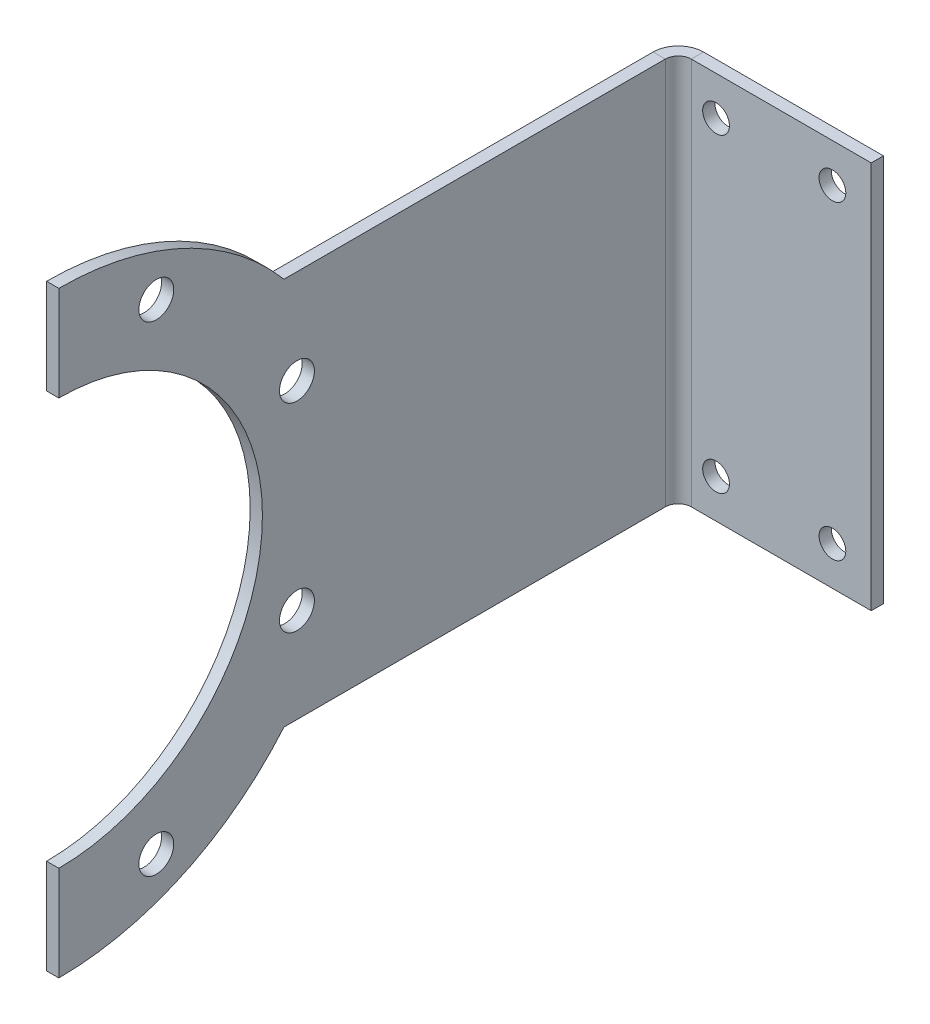
ISO-10303-21;
HEADER;
FILE_DESCRIPTION(('STEP AP214'),'2;1');
FILE_NAME('part.step','',(''),(''),'','','');
FILE_SCHEMA(('AUTOMOTIVE_DESIGN { 1 0 10303 214 1 1 1 1 }'));
ENDSEC;
DATA;
#1=APPLICATION_CONTEXT('core data for automotive mechanical design processes');
#2=APPLICATION_PROTOCOL_DEFINITION('international standard','automotive_design',2000,#1);
#3=PRODUCT_CONTEXT('',#1,'mechanical');
#4=PRODUCT('Part','Part','',(#3));
#5=PRODUCT_RELATED_PRODUCT_CATEGORY('part','',(#4));
#6=PRODUCT_DEFINITION_FORMATION('','',#4);
#7=PRODUCT_DEFINITION_CONTEXT('part definition',#1,'design');
#8=PRODUCT_DEFINITION('design','',#6,#7);
#9=PRODUCT_DEFINITION_SHAPE('','',#8);
#10=(LENGTH_UNIT() NAMED_UNIT(*) SI_UNIT(.MILLI.,.METRE.));
#11=(NAMED_UNIT(*) PLANE_ANGLE_UNIT() SI_UNIT($,.RADIAN.));
#12=(NAMED_UNIT(*) SI_UNIT($,.STERADIAN.) SOLID_ANGLE_UNIT());
#13=UNCERTAINTY_MEASURE_WITH_UNIT(LENGTH_MEASURE(1.E-05),#10,'distance_accuracy_value','');
#14=(GEOMETRIC_REPRESENTATION_CONTEXT(3) GLOBAL_UNCERTAINTY_ASSIGNED_CONTEXT((#13)) GLOBAL_UNIT_ASSIGNED_CONTEXT((#10,
#11,#12)) REPRESENTATION_CONTEXT('',''));
#15=CARTESIAN_POINT('',(0.,0.,0.));
#16=DIRECTION('',(0.,0.,1.));
#17=DIRECTION('',(1.,0.,0.));
#18=AXIS2_PLACEMENT_3D('',#15,#16,#17);
#19=CARTESIAN_POINT('',(78.810179492207,25.,50.8361885638785));
#20=DIRECTION('',(0.,1.,0.));
#21=DIRECTION('',(1.,0.,0.));
#22=AXIS2_PLACEMENT_3D('',#19,#20,#21);
#23=PLANE('',#22);
#24=DIRECTION('',(0.,0.,1.));
#25=VECTOR('',#24,1.);
#26=CARTESIAN_POINT('',(80.384979492207,25.,50.8361885638785));
#27=LINE('',#26,#25);
#28=CARTESIAN_POINT('',(80.3849794922068,25.,1.6764));
#29=VERTEX_POINT('',#28);
#30=CARTESIAN_POINT('',(80.384979492207,25.,50.8361885638785));
#31=VERTEX_POINT('',#30);
#32=EDGE_CURVE('E101',#29,#31,#27,.T.);
#33=ORIENTED_EDGE('',*,*,#32,.F.);
#34=DIRECTION('',(-1.,0.,0.));
#35=VECTOR('',#34,1.);
#36=CARTESIAN_POINT('',(78.8101794922068,25.,1.67640000000001));
#37=LINE('',#36,#35);
#38=CARTESIAN_POINT('',(78.8101794922068,25.,1.67640000000001));
#39=VERTEX_POINT('',#38);
#40=EDGE_CURVE('E176',#29,#39,#37,.T.);
#41=ORIENTED_EDGE('',*,*,#40,.T.);
#42=DIRECTION('',(0.,0.,1.));
#43=VECTOR('',#42,1.);
#44=CARTESIAN_POINT('',(78.8101794922068,25.,-0.134979492206797));
#45=LINE('',#44,#43);
#46=CARTESIAN_POINT('',(78.810179492207,25.,50.8361885638785));
#47=VERTEX_POINT('',#46);
#48=EDGE_CURVE('E51',#39,#47,#45,.T.);
#49=ORIENTED_EDGE('',*,*,#48,.T.);
#50=DIRECTION('',(1.,0.,0.));
#51=VECTOR('',#50,1.);
#52=CARTESIAN_POINT('',(78.810179492207,25.,50.8361885638785));
#53=LINE('',#52,#51);
#54=EDGE_CURVE('E167',#47,#31,#53,.T.);
#55=ORIENTED_EDGE('',*,*,#54,.T.);
#56=EDGE_LOOP('',(#33,#41,#49,#55));
#57=FACE_BOUND('',#56,.T.);
#58=ADVANCED_FACE('F47',(#57),#23,.T.);
#59=CARTESIAN_POINT('',(78.8101794922067,-25.,-25.1349794922068));
#60=DIRECTION('',(0.,-1.,0.));
#61=DIRECTION('',(-1.,0.,0.));
#62=AXIS2_PLACEMENT_3D('',#59,#60,#61);
#63=PLANE('',#62);
#64=DIRECTION('',(0.,0.,-1.));
#65=VECTOR('',#64,1.);
#66=CARTESIAN_POINT('',(78.8101794922068,-25.,-0.134979492206797));
#67=LINE('',#66,#65);
#68=CARTESIAN_POINT('',(78.810179492207,-25.,50.8361885638785));
#69=VERTEX_POINT('',#68);
#70=CARTESIAN_POINT('',(78.8101794922068,-25.,1.67640000000001));
#71=VERTEX_POINT('',#70);
#72=EDGE_CURVE('E145',#69,#71,#67,.T.);
#73=ORIENTED_EDGE('',*,*,#72,.T.);
#74=DIRECTION('',(1.,0.,0.));
#75=VECTOR('',#74,1.);
#76=CARTESIAN_POINT('',(78.8101794922068,-25.,1.67640000000001));
#77=LINE('',#76,#75);
#78=CARTESIAN_POINT('',(80.3849794922068,-25.,1.6764));
#79=VERTEX_POINT('',#78);
#80=EDGE_CURVE('E12',#71,#79,#77,.T.);
#81=ORIENTED_EDGE('',*,*,#80,.T.);
#82=DIRECTION('',(0.,0.,-1.));
#83=VECTOR('',#82,1.);
#84=CARTESIAN_POINT('',(80.3849794922067,-25.,-25.1349794922068));
#85=LINE('',#84,#83);
#86=CARTESIAN_POINT('',(80.384979492207,-25.,50.8361885638785));
#87=VERTEX_POINT('',#86);
#88=EDGE_CURVE('E166',#87,#79,#85,.T.);
#89=ORIENTED_EDGE('',*,*,#88,.F.);
#90=DIRECTION('',(1.,0.,0.));
#91=VECTOR('',#90,1.);
#92=CARTESIAN_POINT('',(78.810179492207,-25.,50.8361885638785));
#93=LINE('',#92,#91);
#94=EDGE_CURVE('E133',#69,#87,#93,.T.);
#95=ORIENTED_EDGE('',*,*,#94,.F.);
#96=EDGE_LOOP('',(#73,#81,#89,#95));
#97=FACE_BOUND('',#96,.T.);
#98=ADVANCED_FACE('F49',(#97),#63,.T.);
#99=CARTESIAN_POINT('',(78.8101794922071,0.537603285694962,79.8650205077932));
#100=DIRECTION('',(-1.,0.,0.));
#101=DIRECTION('',(0.,0.,1.));
#102=AXIS2_PLACEMENT_3D('',#99,#100,#101);
#103=PLANE('',#102);
#104=CARTESIAN_POINT('',(78.810179492207,30.9499643391282,67.2951255235629));
#105=DIRECTION('',(1.,0.,0.));
#106=DIRECTION('',(0.,0.,-1.));
#107=AXIS2_PLACEMENT_3D('',#104,#105,#106);
#108=CIRCLE('',#107,2.25);
#109=CARTESIAN_POINT('',(78.810179492207,30.9499643391282,65.0451255235629));
#110=VERTEX_POINT('',#109);
#111=EDGE_CURVE('E157',#110,#110,#108,.T.);
#112=ORIENTED_EDGE('',*,*,#111,.T.);
#113=EDGE_LOOP('',(#112));
#114=FACE_BOUND('',#113,.T.);
#115=CARTESIAN_POINT('',(78.810179492207,12.8198949842307,49.1650561686652));
#116=DIRECTION('',(1.,0.,0.));
#117=DIRECTION('',(0.,0.,-1.));
#118=AXIS2_PLACEMENT_3D('',#115,#116,#117);
#119=CIRCLE('',#118,2.25);
#120=CARTESIAN_POINT('',(78.810179492207,12.8198949842307,46.9150561686652));
#121=VERTEX_POINT('',#120);
#122=EDGE_CURVE('E191',#121,#121,#119,.T.);
#123=ORIENTED_EDGE('',*,*,#122,.T.);
#124=EDGE_LOOP('',(#123));
#125=FACE_BOUND('',#124,.T.);
#126=CARTESIAN_POINT('',(78.810179492207,-12.8198949842303,49.165056168665));
#127=DIRECTION('',(1.,0.,0.));
#128=DIRECTION('',(0.,0.,-1.));
#129=AXIS2_PLACEMENT_3D('',#126,#127,#128);
#130=CIRCLE('',#129,2.25000000000001);
#131=CARTESIAN_POINT('',(78.810179492207,-12.8198949842303,46.915056168665));
#132=VERTEX_POINT('',#131);
#133=EDGE_CURVE('E197',#132,#132,#130,.T.);
#134=ORIENTED_EDGE('',*,*,#133,.T.);
#135=EDGE_LOOP('',(#134));
#136=FACE_BOUND('',#135,.T.);
#137=CARTESIAN_POINT('',(78.810179492207,-30.949964339128,67.2951255235625));
#138=DIRECTION('',(1.,0.,0.));
#139=DIRECTION('',(0.,0.,-1.));
#140=AXIS2_PLACEMENT_3D('',#137,#138,#139);
#141=CIRCLE('',#140,2.24999999999999);
#142=CARTESIAN_POINT('',(78.810179492207,-30.949964339128,65.0451255235625));
#143=VERTEX_POINT('',#142);
#144=EDGE_CURVE('E203',#143,#143,#141,.T.);
#145=ORIENTED_EDGE('',*,*,#144,.T.);
#146=EDGE_LOOP('',(#145));
#147=FACE_BOUND('',#146,.T.);
#148=ORIENTED_EDGE('',*,*,#48,.F.);
#149=DIRECTION('',(0.,-1.,0.));
#150=VECTOR('',#149,1.);
#151=CARTESIAN_POINT('',(78.8101794922068,0.537603285694962,1.67640000000001));
#152=LINE('',#151,#150);
#153=EDGE_CURVE('E169',#39,#71,#152,.T.);
#154=ORIENTED_EDGE('',*,*,#153,.T.);
#155=ORIENTED_EDGE('',*,*,#72,.F.);
#156=CARTESIAN_POINT('',(78.8101794922071,-0.537603285694967,79.8650205077932));
#157=DIRECTION('',(1.,0.,0.));
#158=DIRECTION('',(0.,0.,-1.));
#159=AXIS2_PLACEMENT_3D('',#156,#157,#158);
#160=CIRCLE('',#159,37.9615850174368);
#161=CARTESIAN_POINT('',(78.8101794922071,-38.4991883031318,79.8650205077932));
#162=VERTEX_POINT('',#161);
#163=EDGE_CURVE('E126',#162,#69,#160,.T.);
#164=ORIENTED_EDGE('',*,*,#163,.F.);
#165=DIRECTION('',(0.,-1.,0.));
#166=VECTOR('',#165,1.);
#167=CARTESIAN_POINT('',(78.8101794922071,-38.4991883031318,79.8650205077932));
#168=LINE('',#167,#166);
#169=CARTESIAN_POINT('',(78.8101794922071,-26.2488094968134,79.8650205077932));
#170=VERTEX_POINT('',#169);
#171=EDGE_CURVE('E141',#170,#162,#168,.T.);
#172=ORIENTED_EDGE('',*,*,#171,.F.);
#173=CARTESIAN_POINT('',(78.8101794922071,0.,79.8650205077932));
#174=DIRECTION('',(-1.,0.,0.));
#175=DIRECTION('',(0.,0.,-1.));
#176=AXIS2_PLACEMENT_3D('',#173,#174,#175);
#177=CIRCLE('',#176,26.2488094968134);
#178=CARTESIAN_POINT('',(78.8101794922071,26.2488094968134,79.8650205077932));
#179=VERTEX_POINT('',#178);
#180=EDGE_CURVE('E148',#179,#170,#177,.T.);
#181=ORIENTED_EDGE('',*,*,#180,.F.);
#182=DIRECTION('',(0.,-1.,0.));
#183=VECTOR('',#182,1.);
#184=CARTESIAN_POINT('',(78.8101794922071,38.4991883031318,79.8650205077932));
#185=LINE('',#184,#183);
#186=CARTESIAN_POINT('',(78.8101794922071,38.4991883031318,79.8650205077932));
#187=VERTEX_POINT('',#186);
#188=EDGE_CURVE('E150',#187,#179,#185,.T.);
#189=ORIENTED_EDGE('',*,*,#188,.F.);
#190=CARTESIAN_POINT('',(78.8101794922071,0.537603285694962,79.8650205077932));
#191=DIRECTION('',(1.,0.,0.));
#192=DIRECTION('',(0.,0.,1.));
#193=AXIS2_PLACEMENT_3D('',#190,#191,#192);
#194=CIRCLE('',#193,37.9615850174368);
#195=EDGE_CURVE('E182',#47,#187,#194,.T.);
#196=ORIENTED_EDGE('',*,*,#195,.F.);
#197=EDGE_LOOP('',(#148,#154,#155,#164,#172,#181,#189,#196));
#198=FACE_BOUND('',#197,.T.);
#199=ADVANCED_FACE('F139',(#114,#125,#136,#147,#198),#103,.T.);
#200=CARTESIAN_POINT('',(78.8101794922071,0.537603285694962,79.8650205077932));
#201=DIRECTION('',(1.,0.,0.));
#202=DIRECTION('',(0.,0.,-1.));
#203=AXIS2_PLACEMENT_3D('',#200,#201,#202);
#204=CYLINDRICAL_SURFACE('',#203,37.9615850174368);
#205=CARTESIAN_POINT('',(80.3849794922071,0.537603285694962,79.8650205077932));
#206=DIRECTION('',(1.,0.,0.));
#207=DIRECTION('',(0.,0.,1.));
#208=AXIS2_PLACEMENT_3D('',#205,#206,#207);
#209=CIRCLE('',#208,37.9615850174368);
#210=CARTESIAN_POINT('',(80.3849794922071,38.4991883031318,79.8650205077932));
#211=VERTEX_POINT('',#210);
#212=EDGE_CURVE('E154',#31,#211,#209,.T.);
#213=ORIENTED_EDGE('',*,*,#212,.F.);
#214=ORIENTED_EDGE('',*,*,#54,.F.);
#215=ORIENTED_EDGE('',*,*,#195,.T.);
#216=DIRECTION('',(1.,0.,0.));
#217=VECTOR('',#216,1.);
#218=CARTESIAN_POINT('',(78.8101794922071,38.4991883031318,79.8650205077932));
#219=LINE('',#218,#217);
#220=EDGE_CURVE('E108',#187,#211,#219,.T.);
#221=ORIENTED_EDGE('',*,*,#220,.T.);
#222=EDGE_LOOP('',(#213,#214,#215,#221));
#223=FACE_BOUND('',#222,.T.);
#224=ADVANCED_FACE('F369',(#223),#204,.T.);
#225=CARTESIAN_POINT('',(78.8101794922071,-0.537603285694967,79.8650205077932));
#226=DIRECTION('',(1.,0.,0.));
#227=DIRECTION('',(0.,0.,-1.));
#228=AXIS2_PLACEMENT_3D('',#225,#226,#227);
#229=CYLINDRICAL_SURFACE('',#228,37.9615850174368);
#230=CARTESIAN_POINT('',(80.3849794922071,-0.537603285694967,79.8650205077932));
#231=DIRECTION('',(1.,0.,0.));
#232=DIRECTION('',(0.,0.,-1.));
#233=AXIS2_PLACEMENT_3D('',#230,#231,#232);
#234=CIRCLE('',#233,37.9615850174368);
#235=CARTESIAN_POINT('',(80.3849794922071,-38.4991883031318,79.8650205077932));
#236=VERTEX_POINT('',#235);
#237=EDGE_CURVE('E128',#236,#87,#234,.T.);
#238=ORIENTED_EDGE('',*,*,#237,.F.);
#239=DIRECTION('',(1.,0.,0.));
#240=VECTOR('',#239,1.);
#241=CARTESIAN_POINT('',(78.8101794922071,-38.4991883031318,79.8650205077932));
#242=LINE('',#241,#240);
#243=EDGE_CURVE('E122',#162,#236,#242,.T.);
#244=ORIENTED_EDGE('',*,*,#243,.F.);
#245=ORIENTED_EDGE('',*,*,#163,.T.);
#246=ORIENTED_EDGE('',*,*,#94,.T.);
#247=EDGE_LOOP('',(#238,#244,#245,#246));
#248=FACE_BOUND('',#247,.T.);
#249=ADVANCED_FACE('F124',(#248),#229,.T.);
#250=CARTESIAN_POINT('',(78.8101794922071,-38.4991883031318,79.8650205077932));
#251=DIRECTION('',(0.,0.,1.));
#252=DIRECTION('',(1.,0.,0.));
#253=AXIS2_PLACEMENT_3D('',#250,#251,#252);
#254=PLANE('',#253);
#255=DIRECTION('',(0.,-1.,0.));
#256=VECTOR('',#255,1.);
#257=CARTESIAN_POINT('',(80.3849794922071,-38.4991883031318,79.8650205077932));
#258=LINE('',#257,#256);
#259=CARTESIAN_POINT('',(80.3849794922071,-26.2488094968134,79.8650205077932));
#260=VERTEX_POINT('',#259);
#261=EDGE_CURVE('E163',#260,#236,#258,.T.);
#262=ORIENTED_EDGE('',*,*,#261,.F.);
#263=DIRECTION('',(1.,0.,0.));
#264=VECTOR('',#263,1.);
#265=CARTESIAN_POINT('',(78.8101794922071,-26.2488094968134,79.8650205077932));
#266=LINE('',#265,#264);
#267=EDGE_CURVE('E134',#170,#260,#266,.T.);
#268=ORIENTED_EDGE('',*,*,#267,.F.);
#269=ORIENTED_EDGE('',*,*,#171,.T.);
#270=ORIENTED_EDGE('',*,*,#243,.T.);
#271=EDGE_LOOP('',(#262,#268,#269,#270));
#272=FACE_BOUND('',#271,.T.);
#273=ADVANCED_FACE('F147',(#272),#254,.T.);
#274=CARTESIAN_POINT('',(78.8101794922071,0.,79.8650205077932));
#275=DIRECTION('',(1.,0.,0.));
#276=DIRECTION('',(0.,0.,-1.));
#277=AXIS2_PLACEMENT_3D('',#274,#275,#276);
#278=CYLINDRICAL_SURFACE('',#277,26.2488094968134);
#279=CARTESIAN_POINT('',(80.3849794922071,0.,79.8650205077932));
#280=DIRECTION('',(-1.,0.,0.));
#281=DIRECTION('',(0.,0.,-1.));
#282=AXIS2_PLACEMENT_3D('',#279,#280,#281);
#283=CIRCLE('',#282,26.2488094968134);
#284=CARTESIAN_POINT('',(80.3849794922071,26.2488094968134,79.8650205077932));
#285=VERTEX_POINT('',#284);
#286=EDGE_CURVE('E160',#285,#260,#283,.T.);
#287=ORIENTED_EDGE('',*,*,#286,.F.);
#288=DIRECTION('',(1.,0.,0.));
#289=VECTOR('',#288,1.);
#290=CARTESIAN_POINT('',(78.8101794922071,26.2488094968134,79.8650205077932));
#291=LINE('',#290,#289);
#292=EDGE_CURVE('E172',#179,#285,#291,.T.);
#293=ORIENTED_EDGE('',*,*,#292,.F.);
#294=ORIENTED_EDGE('',*,*,#180,.T.);
#295=ORIENTED_EDGE('',*,*,#267,.T.);
#296=EDGE_LOOP('',(#287,#293,#294,#295));
#297=FACE_BOUND('',#296,.T.);
#298=ADVANCED_FACE('F361',(#297),#278,.F.);
#299=CARTESIAN_POINT('',(78.8101794922071,38.4991883031318,79.8650205077932));
#300=DIRECTION('',(0.,0.,1.));
#301=DIRECTION('',(0.,-1.,0.));
#302=AXIS2_PLACEMENT_3D('',#299,#300,#301);
#303=PLANE('',#302);
#304=DIRECTION('',(0.,-1.,0.));
#305=VECTOR('',#304,1.);
#306=CARTESIAN_POINT('',(80.3849794922071,38.4991883031318,79.8650205077932));
#307=LINE('',#306,#305);
#308=EDGE_CURVE('E156',#211,#285,#307,.T.);
#309=ORIENTED_EDGE('',*,*,#308,.F.);
#310=ORIENTED_EDGE('',*,*,#220,.F.);
#311=ORIENTED_EDGE('',*,*,#188,.T.);
#312=ORIENTED_EDGE('',*,*,#292,.T.);
#313=EDGE_LOOP('',(#309,#310,#311,#312));
#314=FACE_BOUND('',#313,.T.);
#315=ADVANCED_FACE('F353',(#314),#303,.T.);
#316=CARTESIAN_POINT('',(80.3849794922071,0.537603285694962,79.8650205077932));
#317=DIRECTION('',(-1.,0.,0.));
#318=DIRECTION('',(0.,0.,1.));
#319=AXIS2_PLACEMENT_3D('',#316,#317,#318);
#320=PLANE('',#319);
#321=DIRECTION('',(0.,-1.,0.));
#322=VECTOR('',#321,1.);
#323=CARTESIAN_POINT('',(80.3849794922068,0.537603285694962,1.67640000000001));
#324=LINE('',#323,#322);
#325=EDGE_CURVE('E56',#29,#79,#324,.T.);
#326=ORIENTED_EDGE('',*,*,#325,.F.);
#327=ORIENTED_EDGE('',*,*,#32,.T.);
#328=ORIENTED_EDGE('',*,*,#212,.T.);
#329=ORIENTED_EDGE('',*,*,#308,.T.);
#330=ORIENTED_EDGE('',*,*,#286,.T.);
#331=ORIENTED_EDGE('',*,*,#261,.T.);
#332=ORIENTED_EDGE('',*,*,#237,.T.);
#333=ORIENTED_EDGE('',*,*,#88,.T.);
#334=EDGE_LOOP('',(#326,#327,#328,#329,#330,#331,#332,#333));
#335=FACE_BOUND('',#334,.T.);
#336=CARTESIAN_POINT('',(80.3849794922071,-30.949964339128,67.2951255235625));
#337=DIRECTION('',(1.,0.,0.));
#338=DIRECTION('',(0.,0.,-1.));
#339=AXIS2_PLACEMENT_3D('',#336,#337,#338);
#340=CIRCLE('',#339,2.24999999999999);
#341=CARTESIAN_POINT('',(80.384979492207,-30.949964339128,65.0451255235625));
#342=VERTEX_POINT('',#341);
#343=EDGE_CURVE('E206',#342,#342,#340,.T.);
#344=ORIENTED_EDGE('',*,*,#343,.F.);
#345=EDGE_LOOP('',(#344));
#346=FACE_BOUND('',#345,.T.);
#347=CARTESIAN_POINT('',(80.384979492207,-12.8198949842303,49.165056168665));
#348=DIRECTION('',(1.,0.,0.));
#349=DIRECTION('',(0.,0.,-1.));
#350=AXIS2_PLACEMENT_3D('',#347,#348,#349);
#351=CIRCLE('',#350,2.25000000000001);
#352=CARTESIAN_POINT('',(80.384979492207,-12.8198949842303,46.915056168665));
#353=VERTEX_POINT('',#352);
#354=EDGE_CURVE('E200',#353,#353,#351,.T.);
#355=ORIENTED_EDGE('',*,*,#354,.F.);
#356=EDGE_LOOP('',(#355));
#357=FACE_BOUND('',#356,.T.);
#358=CARTESIAN_POINT('',(80.384979492207,12.8198949842307,49.1650561686652));
#359=DIRECTION('',(1.,0.,0.));
#360=DIRECTION('',(0.,0.,-1.));
#361=AXIS2_PLACEMENT_3D('',#358,#359,#360);
#362=CIRCLE('',#361,2.25);
#363=CARTESIAN_POINT('',(80.384979492207,12.8198949842307,46.9150561686652));
#364=VERTEX_POINT('',#363);
#365=EDGE_CURVE('E194',#364,#364,#362,.T.);
#366=ORIENTED_EDGE('',*,*,#365,.F.);
#367=EDGE_LOOP('',(#366));
#368=FACE_BOUND('',#367,.T.);
#369=CARTESIAN_POINT('',(80.3849794922071,30.9499643391282,67.2951255235629));
#370=DIRECTION('',(1.,0.,0.));
#371=DIRECTION('',(0.,0.,-1.));
#372=AXIS2_PLACEMENT_3D('',#369,#370,#371);
#373=CIRCLE('',#372,2.25);
#374=CARTESIAN_POINT('',(80.384979492207,30.9499643391282,65.0451255235629));
#375=VERTEX_POINT('',#374);
#376=EDGE_CURVE('E188',#375,#375,#373,.T.);
#377=ORIENTED_EDGE('',*,*,#376,.F.);
#378=EDGE_LOOP('',(#377));
#379=FACE_BOUND('',#378,.T.);
#380=ADVANCED_FACE('F295',(#335,#346,#357,#368,#379),#320,.F.);
#381=CARTESIAN_POINT('',(78.810179492207,30.9499643391282,67.2951255235629));
#382=DIRECTION('',(1.,0.,0.));
#383=DIRECTION('',(0.,0.,-1.));
#384=AXIS2_PLACEMENT_3D('',#381,#382,#383);
#385=CYLINDRICAL_SURFACE('',#384,2.25);
#386=ORIENTED_EDGE('',*,*,#111,.F.);
#387=EDGE_LOOP('',(#386));
#388=FACE_BOUND('',#387,.T.);
#389=ORIENTED_EDGE('',*,*,#376,.T.);
#390=EDGE_LOOP('',(#389));
#391=FACE_BOUND('',#390,.T.);
#392=ADVANCED_FACE('F352',(#388,#391),#385,.F.);
#393=CARTESIAN_POINT('',(78.810179492207,12.8198949842307,49.1650561686652));
#394=DIRECTION('',(1.,0.,0.));
#395=DIRECTION('',(0.,0.,-1.));
#396=AXIS2_PLACEMENT_3D('',#393,#394,#395);
#397=CYLINDRICAL_SURFACE('',#396,2.25);
#398=ORIENTED_EDGE('',*,*,#122,.F.);
#399=EDGE_LOOP('',(#398));
#400=FACE_BOUND('',#399,.T.);
#401=ORIENTED_EDGE('',*,*,#365,.T.);
#402=EDGE_LOOP('',(#401));
#403=FACE_BOUND('',#402,.T.);
#404=ADVANCED_FACE('F358',(#400,#403),#397,.F.);
#405=CARTESIAN_POINT('',(78.810179492207,-12.8198949842303,49.165056168665));
#406=DIRECTION('',(1.,0.,0.));
#407=DIRECTION('',(0.,0.,-1.));
#408=AXIS2_PLACEMENT_3D('',#405,#406,#407);
#409=CYLINDRICAL_SURFACE('',#408,2.25000000000001);
#410=ORIENTED_EDGE('',*,*,#133,.F.);
#411=EDGE_LOOP('',(#410));
#412=FACE_BOUND('',#411,.T.);
#413=ORIENTED_EDGE('',*,*,#354,.T.);
#414=EDGE_LOOP('',(#413));
#415=FACE_BOUND('',#414,.T.);
#416=ADVANCED_FACE('F392',(#412,#415),#409,.F.);
#417=CARTESIAN_POINT('',(78.810179492207,-30.949964339128,67.2951255235625));
#418=DIRECTION('',(1.,0.,0.));
#419=DIRECTION('',(0.,0.,-1.));
#420=AXIS2_PLACEMENT_3D('',#417,#418,#419);
#421=CYLINDRICAL_SURFACE('',#420,2.24999999999999);
#422=ORIENTED_EDGE('',*,*,#144,.F.);
#423=EDGE_LOOP('',(#422));
#424=FACE_BOUND('',#423,.T.);
#425=ORIENTED_EDGE('',*,*,#343,.T.);
#426=EDGE_LOOP('',(#425));
#427=FACE_BOUND('',#426,.T.);
#428=ADVANCED_FACE('F388',(#424,#427),#421,.F.);
#429=CARTESIAN_POINT('',(85.25,20.,-1.5748));
#430=DIRECTION('',(0.,0.,1.));
#431=DIRECTION('',(1.,0.,0.));
#432=AXIS2_PLACEMENT_3D('',#429,#430,#431);
#433=CYLINDRICAL_SURFACE('',#432,1.725);
#434=CARTESIAN_POINT('',(85.25,20.,-1.5748));
#435=DIRECTION('',(0.,0.,1.));
#436=DIRECTION('',(1.,0.,0.));
#437=AXIS2_PLACEMENT_3D('',#434,#435,#436);
#438=CIRCLE('',#437,1.725);
#439=CARTESIAN_POINT('',(86.975,20.,-1.5748));
#440=VERTEX_POINT('',#439);
#441=EDGE_CURVE('E247',#440,#440,#438,.T.);
#442=ORIENTED_EDGE('',*,*,#441,.F.);
#443=EDGE_LOOP('',(#442));
#444=FACE_BOUND('',#443,.T.);
#445=CARTESIAN_POINT('',(85.25,20.,0.));
#446=DIRECTION('',(0.,0.,1.));
#447=DIRECTION('',(1.,0.,0.));
#448=AXIS2_PLACEMENT_3D('',#445,#446,#447);
#449=CIRCLE('',#448,1.725);
#450=CARTESIAN_POINT('',(86.975,20.,0.));
#451=VERTEX_POINT('',#450);
#452=EDGE_CURVE('E220',#451,#451,#449,.T.);
#453=ORIENTED_EDGE('',*,*,#452,.T.);
#454=EDGE_LOOP('',(#453));
#455=FACE_BOUND('',#454,.T.);
#456=ADVANCED_FACE('F391',(#444,#455),#433,.F.);
#457=CARTESIAN_POINT('',(100.25,20.,-1.5748));
#458=DIRECTION('',(0.,0.,1.));
#459=DIRECTION('',(1.,0.,0.));
#460=AXIS2_PLACEMENT_3D('',#457,#458,#459);
#461=CYLINDRICAL_SURFACE('',#460,1.725);
#462=CARTESIAN_POINT('',(100.25,20.,-1.5748));
#463=DIRECTION('',(0.,0.,1.));
#464=DIRECTION('',(1.,0.,0.));
#465=AXIS2_PLACEMENT_3D('',#462,#463,#464);
#466=CIRCLE('',#465,1.725);
#467=CARTESIAN_POINT('',(101.975,20.,-1.5748));
#468=VERTEX_POINT('',#467);
#469=EDGE_CURVE('E244',#468,#468,#466,.T.);
#470=ORIENTED_EDGE('',*,*,#469,.F.);
#471=EDGE_LOOP('',(#470));
#472=FACE_BOUND('',#471,.T.);
#473=CARTESIAN_POINT('',(100.25,20.,0.));
#474=DIRECTION('',(0.,0.,1.));
#475=DIRECTION('',(1.,0.,0.));
#476=AXIS2_PLACEMENT_3D('',#473,#474,#475);
#477=CIRCLE('',#476,1.725);
#478=CARTESIAN_POINT('',(101.975,20.,0.));
#479=VERTEX_POINT('',#478);
#480=EDGE_CURVE('E223',#479,#479,#477,.T.);
#481=ORIENTED_EDGE('',*,*,#480,.T.);
#482=EDGE_LOOP('',(#481));
#483=FACE_BOUND('',#482,.T.);
#484=ADVANCED_FACE('F467',(#472,#483),#461,.F.);
#485=CARTESIAN_POINT('',(85.25,-20.,-1.5748));
#486=DIRECTION('',(0.,0.,1.));
#487=DIRECTION('',(1.,0.,0.));
#488=AXIS2_PLACEMENT_3D('',#485,#486,#487);
#489=CYLINDRICAL_SURFACE('',#488,1.725);
#490=CARTESIAN_POINT('',(85.25,-20.,-1.5748));
#491=DIRECTION('',(0.,0.,1.));
#492=DIRECTION('',(1.,0.,0.));
#493=AXIS2_PLACEMENT_3D('',#490,#491,#492);
#494=CIRCLE('',#493,1.725);
#495=CARTESIAN_POINT('',(86.975,-20.,-1.5748));
#496=VERTEX_POINT('',#495);
#497=EDGE_CURVE('E241',#496,#496,#494,.T.);
#498=ORIENTED_EDGE('',*,*,#497,.F.);
#499=EDGE_LOOP('',(#498));
#500=FACE_BOUND('',#499,.T.);
#501=CARTESIAN_POINT('',(85.25,-20.,0.));
#502=DIRECTION('',(0.,0.,1.));
#503=DIRECTION('',(1.,0.,0.));
#504=AXIS2_PLACEMENT_3D('',#501,#502,#503);
#505=CIRCLE('',#504,1.725);
#506=CARTESIAN_POINT('',(86.975,-20.,0.));
#507=VERTEX_POINT('',#506);
#508=EDGE_CURVE('E226',#507,#507,#505,.T.);
#509=ORIENTED_EDGE('',*,*,#508,.T.);
#510=EDGE_LOOP('',(#509));
#511=FACE_BOUND('',#510,.T.);
#512=ADVANCED_FACE('F479',(#500,#511),#489,.F.);
#513=CARTESIAN_POINT('',(100.25,-20.,-1.5748));
#514=DIRECTION('',(0.,0.,1.));
#515=DIRECTION('',(1.,0.,0.));
#516=AXIS2_PLACEMENT_3D('',#513,#514,#515);
#517=CYLINDRICAL_SURFACE('',#516,1.725);
#518=CARTESIAN_POINT('',(100.25,-20.,-1.5748));
#519=DIRECTION('',(0.,0.,1.));
#520=DIRECTION('',(1.,0.,0.));
#521=AXIS2_PLACEMENT_3D('',#518,#519,#520);
#522=CIRCLE('',#521,1.725);
#523=CARTESIAN_POINT('',(101.975,-20.,-1.5748));
#524=VERTEX_POINT('',#523);
#525=EDGE_CURVE('E238',#524,#524,#522,.T.);
#526=ORIENTED_EDGE('',*,*,#525,.F.);
#527=EDGE_LOOP('',(#526));
#528=FACE_BOUND('',#527,.T.);
#529=CARTESIAN_POINT('',(100.25,-20.,0.));
#530=DIRECTION('',(0.,0.,1.));
#531=DIRECTION('',(1.,0.,0.));
#532=AXIS2_PLACEMENT_3D('',#529,#530,#531);
#533=CIRCLE('',#532,1.725);
#534=CARTESIAN_POINT('',(101.975,-20.,0.));
#535=VERTEX_POINT('',#534);
#536=EDGE_CURVE('E229',#535,#535,#533,.T.);
#537=ORIENTED_EDGE('',*,*,#536,.T.);
#538=EDGE_LOOP('',(#537));
#539=FACE_BOUND('',#538,.T.);
#540=ADVANCED_FACE('F490',(#528,#539),#517,.F.);
#541=CARTESIAN_POINT('',(105.25,25.,-1.5748));
#542=DIRECTION('',(1.,0.,0.));
#543=DIRECTION('',(0.,0.,-1.));
#544=AXIS2_PLACEMENT_3D('',#541,#542,#543);
#545=PLANE('',#544);
#546=DIRECTION('',(0.,1.,0.));
#547=VECTOR('',#546,1.);
#548=CARTESIAN_POINT('',(105.25,25.,0.));
#549=LINE('',#548,#547);
#550=CARTESIAN_POINT('',(105.25,-25.,0.));
#551=VERTEX_POINT('',#550);
#552=CARTESIAN_POINT('',(105.25,25.,0.));
#553=VERTEX_POINT('',#552);
#554=EDGE_CURVE('E262',#551,#553,#549,.T.);
#555=ORIENTED_EDGE('',*,*,#554,.F.);
#556=DIRECTION('',(0.,0.,1.));
#557=VECTOR('',#556,1.);
#558=CARTESIAN_POINT('',(105.25,-25.,-1.5748));
#559=LINE('',#558,#557);
#560=CARTESIAN_POINT('',(105.25,-25.,-1.5748));
#561=VERTEX_POINT('',#560);
#562=EDGE_CURVE('E209',#561,#551,#559,.T.);
#563=ORIENTED_EDGE('',*,*,#562,.F.);
#564=DIRECTION('',(0.,1.,0.));
#565=VECTOR('',#564,1.);
#566=CARTESIAN_POINT('',(105.25,25.,-1.5748));
#567=LINE('',#566,#565);
#568=CARTESIAN_POINT('',(105.25,25.,-1.5748));
#569=VERTEX_POINT('',#568);
#570=EDGE_CURVE('E232',#561,#569,#567,.T.);
#571=ORIENTED_EDGE('',*,*,#570,.T.);
#572=DIRECTION('',(0.,0.,1.));
#573=VECTOR('',#572,1.);
#574=CARTESIAN_POINT('',(105.25,25.,-1.5748));
#575=LINE('',#574,#573);
#576=EDGE_CURVE('E235',#569,#553,#575,.T.);
#577=ORIENTED_EDGE('',*,*,#576,.T.);
#578=EDGE_LOOP('',(#555,#563,#571,#577));
#579=FACE_BOUND('',#578,.T.);
#580=ADVANCED_FACE('F322',(#579),#545,.T.);
#581=CARTESIAN_POINT('',(0.25,0.537603285694962,-1.5748));
#582=DIRECTION('',(0.,0.,-1.));
#583=DIRECTION('',(-1.,0.,0.));
#584=AXIS2_PLACEMENT_3D('',#581,#582,#583);
#585=PLANE('',#584);
#586=DIRECTION('',(0.,-1.,0.));
#587=VECTOR('',#586,1.);
#588=CARTESIAN_POINT('',(82.0613794922068,0.537603285694962,-1.5748));
#589=LINE('',#588,#587);
#590=CARTESIAN_POINT('',(82.0613794922068,25.,-1.5748));
#591=VERTEX_POINT('',#590);
#592=CARTESIAN_POINT('',(82.0613794922068,-25.,-1.5748));
#593=VERTEX_POINT('',#592);
#594=EDGE_CURVE('E212',#591,#593,#589,.T.);
#595=ORIENTED_EDGE('',*,*,#594,.F.);
#596=DIRECTION('',(-1.,0.,0.));
#597=VECTOR('',#596,1.);
#598=CARTESIAN_POINT('',(80.25,25.,-1.5748));
#599=LINE('',#598,#597);
#600=EDGE_CURVE('E250',#569,#591,#599,.T.);
#601=ORIENTED_EDGE('',*,*,#600,.F.);
#602=ORIENTED_EDGE('',*,*,#570,.F.);
#603=DIRECTION('',(1.,0.,0.));
#604=VECTOR('',#603,1.);
#605=CARTESIAN_POINT('',(80.25,-25.,-1.5748));
#606=LINE('',#605,#604);
#607=EDGE_CURVE('E265',#593,#561,#606,.T.);
#608=ORIENTED_EDGE('',*,*,#607,.F.);
#609=EDGE_LOOP('',(#595,#601,#602,#608));
#610=FACE_BOUND('',#609,.T.);
#611=ORIENTED_EDGE('',*,*,#525,.T.);
#612=EDGE_LOOP('',(#611));
#613=FACE_BOUND('',#612,.T.);
#614=ORIENTED_EDGE('',*,*,#497,.T.);
#615=EDGE_LOOP('',(#614));
#616=FACE_BOUND('',#615,.T.);
#617=ORIENTED_EDGE('',*,*,#469,.T.);
#618=EDGE_LOOP('',(#617));
#619=FACE_BOUND('',#618,.T.);
#620=ORIENTED_EDGE('',*,*,#441,.T.);
#621=EDGE_LOOP('',(#620));
#622=FACE_BOUND('',#621,.T.);
#623=ADVANCED_FACE('F314',(#610,#613,#616,#619,#622),#585,.T.);
#624=CARTESIAN_POINT('',(29.2788319439147,25.,-1.5748));
#625=DIRECTION('',(0.,1.,0.));
#626=DIRECTION('',(0.,0.,1.));
#627=AXIS2_PLACEMENT_3D('',#624,#625,#626);
#628=PLANE('',#627);
#629=DIRECTION('',(0.,0.,-1.));
#630=VECTOR('',#629,1.);
#631=CARTESIAN_POINT('',(82.0613794922068,25.,-1.5748));
#632=LINE('',#631,#630);
#633=CARTESIAN_POINT('',(82.0613794922068,25.,0.));
#634=VERTEX_POINT('',#633);
#635=EDGE_CURVE('E217',#634,#591,#632,.T.);
#636=ORIENTED_EDGE('',*,*,#635,.F.);
#637=DIRECTION('',(-1.,0.,0.));
#638=VECTOR('',#637,1.);
#639=CARTESIAN_POINT('',(29.2788319439147,25.,0.));
#640=LINE('',#639,#638);
#641=EDGE_CURVE('E253',#553,#634,#640,.T.);
#642=ORIENTED_EDGE('',*,*,#641,.F.);
#643=ORIENTED_EDGE('',*,*,#576,.F.);
#644=ORIENTED_EDGE('',*,*,#600,.T.);
#645=EDGE_LOOP('',(#636,#642,#643,#644));
#646=FACE_BOUND('',#645,.T.);
#647=ADVANCED_FACE('F333',(#646),#628,.T.);
#648=CARTESIAN_POINT('',(0.25,0.537603285694962,0.));
#649=DIRECTION('',(0.,0.,-1.));
#650=DIRECTION('',(-1.,0.,0.));
#651=AXIS2_PLACEMENT_3D('',#648,#649,#650);
#652=PLANE('',#651);
#653=ORIENTED_EDGE('',*,*,#452,.F.);
#654=EDGE_LOOP('',(#653));
#655=FACE_BOUND('',#654,.T.);
#656=ORIENTED_EDGE('',*,*,#480,.F.);
#657=EDGE_LOOP('',(#656));
#658=FACE_BOUND('',#657,.T.);
#659=ORIENTED_EDGE('',*,*,#508,.F.);
#660=EDGE_LOOP('',(#659));
#661=FACE_BOUND('',#660,.T.);
#662=ORIENTED_EDGE('',*,*,#536,.F.);
#663=EDGE_LOOP('',(#662));
#664=FACE_BOUND('',#663,.T.);
#665=ORIENTED_EDGE('',*,*,#641,.T.);
#666=DIRECTION('',(0.,-1.,0.));
#667=VECTOR('',#666,1.);
#668=CARTESIAN_POINT('',(82.0613794922068,0.537603285694962,0.));
#669=LINE('',#668,#667);
#670=CARTESIAN_POINT('',(82.0613794922068,-25.,0.));
#671=VERTEX_POINT('',#670);
#672=EDGE_CURVE('E256',#634,#671,#669,.T.);
#673=ORIENTED_EDGE('',*,*,#672,.T.);
#674=DIRECTION('',(1.,0.,0.));
#675=VECTOR('',#674,1.);
#676=CARTESIAN_POINT('',(105.25,-25.,0.));
#677=LINE('',#676,#675);
#678=EDGE_CURVE('E259',#671,#551,#677,.T.);
#679=ORIENTED_EDGE('',*,*,#678,.T.);
#680=ORIENTED_EDGE('',*,*,#554,.T.);
#681=EDGE_LOOP('',(#665,#673,#679,#680));
#682=FACE_BOUND('',#681,.T.);
#683=ADVANCED_FACE('F332',(#655,#658,#661,#664,#682),#652,.F.);
#684=CARTESIAN_POINT('',(105.25,-25.,-1.5748));
#685=DIRECTION('',(0.,-1.,0.));
#686=DIRECTION('',(0.,0.,-1.));
#687=AXIS2_PLACEMENT_3D('',#684,#685,#686);
#688=PLANE('',#687);
#689=DIRECTION('',(0.,0.,1.));
#690=VECTOR('',#689,1.);
#691=CARTESIAN_POINT('',(82.0613794922068,-25.,-1.5748));
#692=LINE('',#691,#690);
#693=EDGE_CURVE('E214',#593,#671,#692,.T.);
#694=ORIENTED_EDGE('',*,*,#693,.F.);
#695=ORIENTED_EDGE('',*,*,#607,.T.);
#696=ORIENTED_EDGE('',*,*,#562,.T.);
#697=ORIENTED_EDGE('',*,*,#678,.F.);
#698=EDGE_LOOP('',(#694,#695,#696,#697));
#699=FACE_BOUND('',#698,.T.);
#700=ADVANCED_FACE('F309',(#699),#688,.T.);
#701=CARTESIAN_POINT('',(82.0613794922068,25.,1.6764));
#702=DIRECTION('',(0.,1.,0.));
#703=DIRECTION('',(0.,0.,1.));
#704=AXIS2_PLACEMENT_3D('',#701,#702,#703);
#705=PLANE('',#704);
#706=ORIENTED_EDGE('',*,*,#40,.F.);
#707=CARTESIAN_POINT('',(82.0613794922068,25.,1.6764));
#708=DIRECTION('',(0.,1.,0.));
#709=DIRECTION('',(0.,0.,1.));
#710=AXIS2_PLACEMENT_3D('',#707,#708,#709);
#711=CIRCLE('',#710,1.6764);
#712=EDGE_CURVE('E274',#29,#634,#711,.F.);
#713=ORIENTED_EDGE('',*,*,#712,.T.);
#714=ORIENTED_EDGE('',*,*,#635,.T.);
#715=CARTESIAN_POINT('',(82.0613794922068,25.,1.6764));
#716=DIRECTION('',(0.,-1.,0.));
#717=DIRECTION('',(0.,0.,1.));
#718=AXIS2_PLACEMENT_3D('',#715,#716,#717);
#719=CIRCLE('',#718,3.2512);
#720=EDGE_CURVE('E273',#39,#591,#719,.T.);
#721=ORIENTED_EDGE('',*,*,#720,.F.);
#722=EDGE_LOOP('',(#706,#713,#714,#721));
#723=FACE_BOUND('',#722,.T.);
#724=ADVANCED_FACE('F287',(#723),#705,.T.);
#725=CARTESIAN_POINT('',(82.0613794922068,-25.,1.6764));
#726=DIRECTION('',(0.,-1.,0.));
#727=DIRECTION('',(0.,0.,-1.));
#728=AXIS2_PLACEMENT_3D('',#725,#726,#727);
#729=PLANE('',#728);
#730=CARTESIAN_POINT('',(82.0613794922068,-25.,1.6764));
#731=DIRECTION('',(0.,1.,0.));
#732=DIRECTION('',(0.,0.,1.));
#733=AXIS2_PLACEMENT_3D('',#730,#731,#732);
#734=CIRCLE('',#733,1.6764);
#735=EDGE_CURVE('E270',#671,#79,#734,.T.);
#736=ORIENTED_EDGE('',*,*,#735,.T.);
#737=ORIENTED_EDGE('',*,*,#80,.F.);
#738=CARTESIAN_POINT('',(82.0613794922068,-25.,1.6764));
#739=DIRECTION('',(0.,1.,0.));
#740=DIRECTION('',(0.,0.,-1.));
#741=AXIS2_PLACEMENT_3D('',#738,#739,#740);
#742=CIRCLE('',#741,3.2512);
#743=EDGE_CURVE('E64',#593,#71,#742,.T.);
#744=ORIENTED_EDGE('',*,*,#743,.F.);
#745=ORIENTED_EDGE('',*,*,#693,.T.);
#746=EDGE_LOOP('',(#736,#737,#744,#745));
#747=FACE_BOUND('',#746,.T.);
#748=ADVANCED_FACE('F304',(#747),#729,.T.);
#749=CARTESIAN_POINT('',(82.0613794922068,-50.1558010373591,1.6764));
#750=DIRECTION('',(0.,1.,0.));
#751=DIRECTION('',(0.,0.,1.));
#752=AXIS2_PLACEMENT_3D('',#749,#750,#751);
#753=CYLINDRICAL_SURFACE('',#752,3.2512);
#754=ORIENTED_EDGE('',*,*,#594,.T.);
#755=ORIENTED_EDGE('',*,*,#743,.T.);
#756=ORIENTED_EDGE('',*,*,#153,.F.);
#757=ORIENTED_EDGE('',*,*,#720,.T.);
#758=EDGE_LOOP('',(#754,#755,#756,#757));
#759=FACE_BOUND('',#758,.T.);
#760=ADVANCED_FACE('F281',(#759),#753,.T.);
#761=CARTESIAN_POINT('',(82.0613794922068,-50.1558010373591,1.6764));
#762=DIRECTION('',(0.,1.,0.));
#763=DIRECTION('',(0.,0.,1.));
#764=AXIS2_PLACEMENT_3D('',#761,#762,#763);
#765=CYLINDRICAL_SURFACE('',#764,1.6764);
#766=ORIENTED_EDGE('',*,*,#672,.F.);
#767=ORIENTED_EDGE('',*,*,#712,.F.);
#768=ORIENTED_EDGE('',*,*,#325,.T.);
#769=ORIENTED_EDGE('',*,*,#735,.F.);
#770=EDGE_LOOP('',(#766,#767,#768,#769));
#771=FACE_BOUND('',#770,.T.);
#772=ADVANCED_FACE('F300',(#771),#765,.F.);
#773=CLOSED_SHELL('',(#58,#98,#199,#224,#249,#273,#298,#315,#380,#392,#404,#416,#428,#456,#484,
#512,#540,#580,#623,#647,#683,#700,#724,#748,#760,#772));
#774=MANIFOLD_SOLID_BREP('B2',#773);
#775=ADVANCED_BREP_SHAPE_REPRESENTATION('',(#18,#774),#14);
#776=SHAPE_DEFINITION_REPRESENTATION(#9,#775);
ENDSEC;
END-ISO-10303-21;
